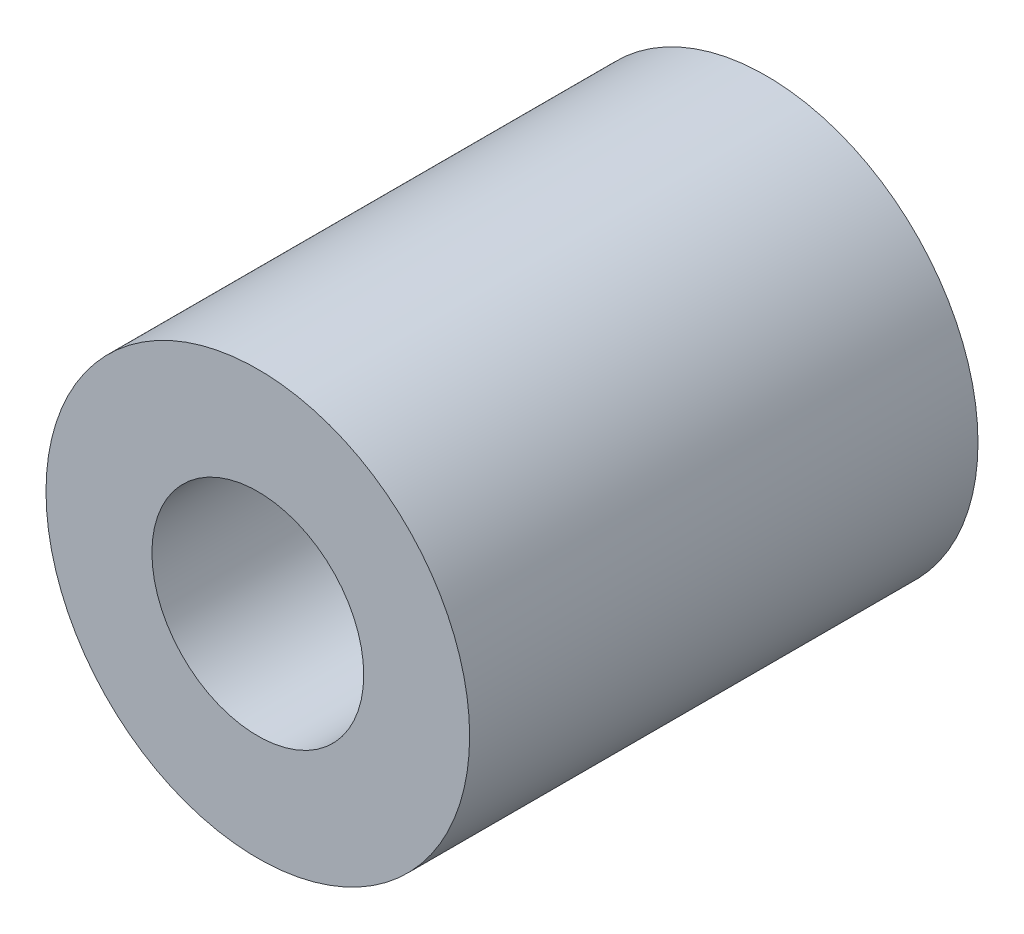
ISO-10303-21;
HEADER;
FILE_DESCRIPTION(('STEP AP214'),'2;1');
FILE_NAME('part.step','',(''),(''),'','','');
FILE_SCHEMA(('AUTOMOTIVE_DESIGN { 1 0 10303 214 1 1 1 1 }'));
ENDSEC;
DATA;
#1=APPLICATION_CONTEXT('core data for automotive mechanical design processes');
#2=APPLICATION_PROTOCOL_DEFINITION('international standard','automotive_design',2000,#1);
#3=PRODUCT_CONTEXT('',#1,'mechanical');
#4=PRODUCT('Part','Part','',(#3));
#5=PRODUCT_RELATED_PRODUCT_CATEGORY('part','',(#4));
#6=PRODUCT_DEFINITION_FORMATION('','',#4);
#7=PRODUCT_DEFINITION_CONTEXT('part definition',#1,'design');
#8=PRODUCT_DEFINITION('design','',#6,#7);
#9=PRODUCT_DEFINITION_SHAPE('','',#8);
#10=(LENGTH_UNIT() NAMED_UNIT(*) SI_UNIT(.MILLI.,.METRE.));
#11=(NAMED_UNIT(*) PLANE_ANGLE_UNIT() SI_UNIT($,.RADIAN.));
#12=(NAMED_UNIT(*) SI_UNIT($,.STERADIAN.) SOLID_ANGLE_UNIT());
#13=UNCERTAINTY_MEASURE_WITH_UNIT(LENGTH_MEASURE(1.E-05),#10,'distance_accuracy_value','');
#14=(GEOMETRIC_REPRESENTATION_CONTEXT(3) GLOBAL_UNCERTAINTY_ASSIGNED_CONTEXT((#13)) GLOBAL_UNIT_ASSIGNED_CONTEXT((#10,
#11,#12)) REPRESENTATION_CONTEXT('',''));
#15=CARTESIAN_POINT('',(0.,0.,0.));
#16=DIRECTION('',(0.,0.,1.));
#17=DIRECTION('',(1.,0.,0.));
#18=AXIS2_PLACEMENT_3D('',#15,#16,#17);
#19=CARTESIAN_POINT('',(0.,1.,6.));
#20=DIRECTION('',(0.,0.,-1.));
#21=DIRECTION('',(-1.,0.,0.));
#22=AXIS2_PLACEMENT_3D('',#19,#20,#21);
#23=CYLINDRICAL_SURFACE('',#22,2.5);
#24=CARTESIAN_POINT('',(0.,1.,6.));
#25=DIRECTION('',(0.,0.,1.));
#26=DIRECTION('',(1.,0.,0.));
#27=AXIS2_PLACEMENT_3D('',#24,#25,#26);
#28=CIRCLE('',#27,2.5);
#29=CARTESIAN_POINT('',(2.5,1.,6.));
#30=VERTEX_POINT('',#29);
#31=EDGE_CURVE('E10',#30,#30,#28,.T.);
#32=ORIENTED_EDGE('',*,*,#31,.F.);
#33=EDGE_LOOP('',(#32));
#34=FACE_BOUND('',#33,.T.);
#35=CARTESIAN_POINT('',(0.,1.,0.));
#36=DIRECTION('',(0.,0.,1.));
#37=DIRECTION('',(1.,0.,0.));
#38=AXIS2_PLACEMENT_3D('',#35,#36,#37);
#39=CIRCLE('',#38,2.5);
#40=CARTESIAN_POINT('',(2.5,1.,0.));
#41=VERTEX_POINT('',#40);
#42=EDGE_CURVE('E44',#41,#41,#39,.T.);
#43=ORIENTED_EDGE('',*,*,#42,.T.);
#44=EDGE_LOOP('',(#43));
#45=FACE_BOUND('',#44,.T.);
#46=ADVANCED_FACE('F41',(#34,#45),#23,.T.);
#47=CARTESIAN_POINT('',(0.,1.,6.));
#48=DIRECTION('',(0.,0.,1.));
#49=DIRECTION('',(1.,0.,0.));
#50=AXIS2_PLACEMENT_3D('',#47,#48,#49);
#51=PLANE('',#50);
#52=CARTESIAN_POINT('',(0.,1.,6.));
#53=DIRECTION('',(0.,0.,-1.));
#54=DIRECTION('',(-1.,0.,0.));
#55=AXIS2_PLACEMENT_3D('',#52,#53,#54);
#56=CIRCLE('',#55,1.25);
#57=CARTESIAN_POINT('',(-1.25,1.,6.));
#58=VERTEX_POINT('',#57);
#59=EDGE_CURVE('E56',#58,#58,#56,.T.);
#60=ORIENTED_EDGE('',*,*,#59,.T.);
#61=EDGE_LOOP('',(#60));
#62=FACE_BOUND('',#61,.T.);
#63=ORIENTED_EDGE('',*,*,#31,.T.);
#64=EDGE_LOOP('',(#63));
#65=FACE_BOUND('',#64,.T.);
#66=ADVANCED_FACE('F75',(#62,#65),#51,.T.);
#67=CARTESIAN_POINT('',(0.,1.,0.));
#68=DIRECTION('',(0.,0.,1.));
#69=DIRECTION('',(1.,0.,0.));
#70=AXIS2_PLACEMENT_3D('',#67,#68,#69);
#71=PLANE('',#70);
#72=CARTESIAN_POINT('',(0.,1.,0.));
#73=DIRECTION('',(0.,0.,-1.));
#74=DIRECTION('',(-1.,0.,0.));
#75=AXIS2_PLACEMENT_3D('',#72,#73,#74);
#76=CIRCLE('',#75,1.65);
#77=CARTESIAN_POINT('',(-1.65,1.,0.));
#78=VERTEX_POINT('',#77);
#79=EDGE_CURVE('E64',#78,#78,#76,.T.);
#80=ORIENTED_EDGE('',*,*,#79,.F.);
#81=EDGE_LOOP('',(#80));
#82=FACE_BOUND('',#81,.T.);
#83=ORIENTED_EDGE('',*,*,#42,.F.);
#84=EDGE_LOOP('',(#83));
#85=FACE_BOUND('',#84,.T.);
#86=ADVANCED_FACE('F71',(#82,#85),#71,.F.);
#87=CARTESIAN_POINT('',(0.,1.,0.));
#88=DIRECTION('',(0.,0.,-1.));
#89=DIRECTION('',(-1.,0.,0.));
#90=AXIS2_PLACEMENT_3D('',#87,#88,#89);
#91=CYLINDRICAL_SURFACE('',#90,1.25);
#92=ORIENTED_EDGE('',*,*,#59,.F.);
#93=EDGE_LOOP('',(#92));
#94=FACE_BOUND('',#93,.T.);
#95=CARTESIAN_POINT('',(0.,1.,0.4));
#96=DIRECTION('',(0.,0.,-1.));
#97=DIRECTION('',(-1.,0.,0.));
#98=AXIS2_PLACEMENT_3D('',#95,#96,#97);
#99=CIRCLE('',#98,1.25);
#100=CARTESIAN_POINT('',(-1.25,1.,0.4));
#101=VERTEX_POINT('',#100);
#102=EDGE_CURVE('E60',#101,#101,#99,.T.);
#103=ORIENTED_EDGE('',*,*,#102,.T.);
#104=EDGE_LOOP('',(#103));
#105=FACE_BOUND('',#104,.T.);
#106=ADVANCED_FACE('F74',(#94,#105),#91,.F.);
#107=CARTESIAN_POINT('',(0.,1.,0.));
#108=DIRECTION('',(0.,0.,-1.));
#109=DIRECTION('',(-1.,0.,0.));
#110=AXIS2_PLACEMENT_3D('',#107,#108,#109);
#111=CONICAL_SURFACE('',#110,1.65,0.785398163397449);
#112=ORIENTED_EDGE('',*,*,#102,.F.);
#113=EDGE_LOOP('',(#112));
#114=FACE_BOUND('',#113,.T.);
#115=ORIENTED_EDGE('',*,*,#79,.T.);
#116=EDGE_LOOP('',(#115));
#117=FACE_BOUND('',#116,.T.);
#118=ADVANCED_FACE('F69',(#114,#117),#111,.F.);
#119=CLOSED_SHELL('',(#46,#66,#86,#106,#118));
#120=MANIFOLD_SOLID_BREP('B2',#119);
#121=ADVANCED_BREP_SHAPE_REPRESENTATION('',(#18,#120),#14);
#122=SHAPE_DEFINITION_REPRESENTATION(#9,#121);
ENDSEC;
END-ISO-10303-21;
